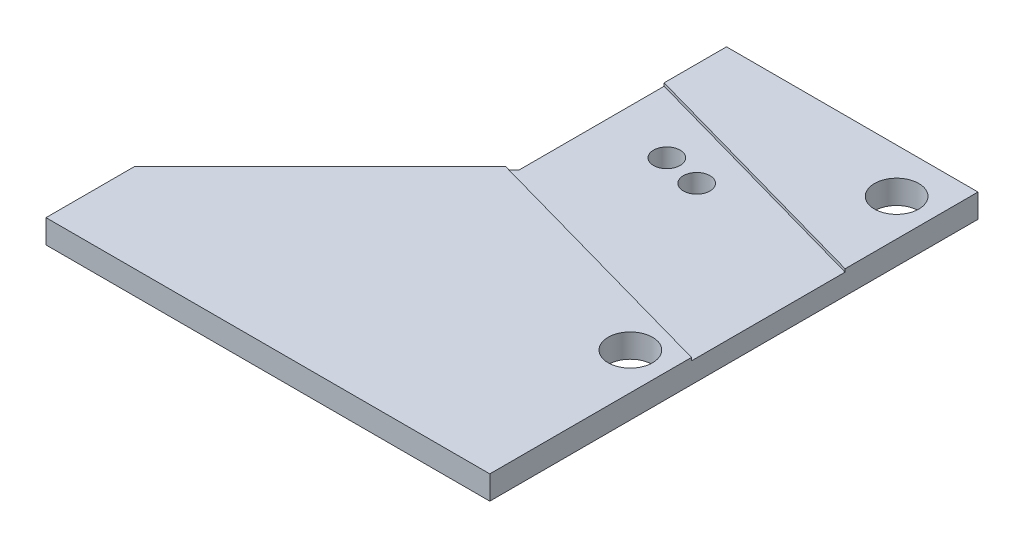
ISO-10303-21;
HEADER;
FILE_DESCRIPTION(('STEP AP214'),'2;1');
FILE_NAME('part.step','',(''),(''),'','','');
FILE_SCHEMA(('AUTOMOTIVE_DESIGN { 1 0 10303 214 1 1 1 1 }'));
ENDSEC;
DATA;
#1=APPLICATION_CONTEXT('core data for automotive mechanical design processes');
#2=APPLICATION_PROTOCOL_DEFINITION('international standard','automotive_design',2000,#1);
#3=PRODUCT_CONTEXT('',#1,'mechanical');
#4=PRODUCT('Part','Part','',(#3));
#5=PRODUCT_RELATED_PRODUCT_CATEGORY('part','',(#4));
#6=PRODUCT_DEFINITION_FORMATION('','',#4);
#7=PRODUCT_DEFINITION_CONTEXT('part definition',#1,'design');
#8=PRODUCT_DEFINITION('design','',#6,#7);
#9=PRODUCT_DEFINITION_SHAPE('','',#8);
#10=(LENGTH_UNIT() NAMED_UNIT(*) SI_UNIT(.MILLI.,.METRE.));
#11=(NAMED_UNIT(*) PLANE_ANGLE_UNIT() SI_UNIT($,.RADIAN.));
#12=(NAMED_UNIT(*) SI_UNIT($,.STERADIAN.) SOLID_ANGLE_UNIT());
#13=UNCERTAINTY_MEASURE_WITH_UNIT(LENGTH_MEASURE(1.E-05),#10,'distance_accuracy_value','');
#14=(GEOMETRIC_REPRESENTATION_CONTEXT(3) GLOBAL_UNCERTAINTY_ASSIGNED_CONTEXT((#13)) GLOBAL_UNIT_ASSIGNED_CONTEXT((#10,
#11,#12)) REPRESENTATION_CONTEXT('',''));
#15=CARTESIAN_POINT('',(0.,0.,0.));
#16=DIRECTION('',(0.,0.,1.));
#17=DIRECTION('',(1.,0.,0.));
#18=AXIS2_PLACEMENT_3D('',#15,#16,#17);
#19=CARTESIAN_POINT('',(-17.,1.6,-12.));
#20=DIRECTION('',(0.,-1.,0.));
#21=DIRECTION('',(0.,0.,-1.));
#22=AXIS2_PLACEMENT_3D('',#19,#20,#21);
#23=PLANE('',#22);
#24=CARTESIAN_POINT('',(-2.49999999999999,1.6,-9.00000000000003));
#25=DIRECTION('',(0.,1.,0.));
#26=DIRECTION('',(0.,0.,1.));
#27=AXIS2_PLACEMENT_3D('',#24,#25,#26);
#28=CIRCLE('',#27,1.5);
#29=CARTESIAN_POINT('',(-2.49999999999999,1.6,-7.50000000000003));
#30=VERTEX_POINT('',#29);
#31=EDGE_CURVE('E206',#30,#30,#28,.T.);
#32=ORIENTED_EDGE('',*,*,#31,.F.);
#33=EDGE_LOOP('',(#32));
#34=FACE_BOUND('',#33,.T.);
#35=DIRECTION('',(0.,0.,1.));
#36=VECTOR('',#35,1.);
#37=CARTESIAN_POINT('',(-17.,1.6,1.99999999999997));
#38=LINE('',#37,#36);
#39=CARTESIAN_POINT('',(-17.,1.6,-12.));
#40=VERTEX_POINT('',#39);
#41=CARTESIAN_POINT('',(-17.,1.6,-7.78282788304414));
#42=VERTEX_POINT('',#41);
#43=EDGE_CURVE('E145',#40,#42,#38,.T.);
#44=ORIENTED_EDGE('',*,*,#43,.T.);
#45=DIRECTION('',(-0.96288130445857,0.,-0.269925162821406));
#46=VECTOR('',#45,1.);
#47=CARTESIAN_POINT('',(0.,1.6,-3.01720646458265));
#48=LINE('',#47,#46);
#49=CARTESIAN_POINT('',(0.,1.6,-3.01720646458265));
#50=VERTEX_POINT('',#49);
#51=EDGE_CURVE('E189',#50,#42,#48,.T.);
#52=ORIENTED_EDGE('',*,*,#51,.F.);
#53=DIRECTION('',(0.,0.,-1.));
#54=VECTOR('',#53,1.);
#55=CARTESIAN_POINT('',(0.,1.6,-12.));
#56=LINE('',#55,#54);
#57=CARTESIAN_POINT('',(0.,1.6,-12.));
#58=VERTEX_POINT('',#57);
#59=EDGE_CURVE('E110',#50,#58,#56,.T.);
#60=ORIENTED_EDGE('',*,*,#59,.T.);
#61=DIRECTION('',(-1.,0.,0.));
#62=VECTOR('',#61,1.);
#63=CARTESIAN_POINT('',(-17.,1.6,-12.));
#64=LINE('',#63,#62);
#65=EDGE_CURVE('E56',#58,#40,#64,.T.);
#66=ORIENTED_EDGE('',*,*,#65,.T.);
#67=EDGE_LOOP('',(#44,#52,#60,#66));
#68=FACE_BOUND('',#67,.T.);
#69=ADVANCED_FACE('F31',(#34,#68),#23,.F.);
#70=CARTESIAN_POINT('',(-12.7196307856983,0.,-3.68506051274071));
#71=DIRECTION('',(0.,1.,0.));
#72=DIRECTION('',(0.,0.,1.));
#73=AXIS2_PLACEMENT_3D('',#70,#71,#72);
#74=CYLINDRICAL_SURFACE('',#73,0.900000000000002);
#75=CARTESIAN_POINT('',(-12.7196307856983,0.,-3.68506051274071));
#76=DIRECTION('',(0.,1.,0.));
#77=DIRECTION('',(0.,0.,1.));
#78=AXIS2_PLACEMENT_3D('',#75,#76,#77);
#79=CIRCLE('',#78,0.900000000000002);
#80=CARTESIAN_POINT('',(-12.7196307856983,0.,-2.78506051274071));
#81=VERTEX_POINT('',#80);
#82=EDGE_CURVE('E137',#81,#81,#79,.T.);
#83=ORIENTED_EDGE('',*,*,#82,.F.);
#84=EDGE_LOOP('',(#83));
#85=FACE_BOUND('',#84,.T.);
#86=CARTESIAN_POINT('',(-12.7196307856983,1.4,-3.68506051274071));
#87=DIRECTION('',(0.,1.,0.));
#88=DIRECTION('',(0.,0.,1.));
#89=AXIS2_PLACEMENT_3D('',#86,#87,#88);
#90=CIRCLE('',#89,0.900000000000002);
#91=CARTESIAN_POINT('',(-12.7196307856983,1.4,-2.78506051274071));
#92=VERTEX_POINT('',#91);
#93=EDGE_CURVE('E176',#92,#92,#90,.F.);
#94=ORIENTED_EDGE('',*,*,#93,.F.);
#95=EDGE_LOOP('',(#94));
#96=FACE_BOUND('',#95,.T.);
#97=ADVANCED_FACE('F238',(#85,#96),#74,.F.);
#98=CARTESIAN_POINT('',(-10.2158849243789,0.,-3.20157663304442));
#99=DIRECTION('',(0.,1.,0.));
#100=DIRECTION('',(0.,0.,1.));
#101=AXIS2_PLACEMENT_3D('',#98,#99,#100);
#102=CYLINDRICAL_SURFACE('',#101,0.900000000000002);
#103=CARTESIAN_POINT('',(-10.2158849243789,0.,-3.20157663304442));
#104=DIRECTION('',(0.,1.,0.));
#105=DIRECTION('',(0.,0.,1.));
#106=AXIS2_PLACEMENT_3D('',#103,#104,#105);
#107=CIRCLE('',#106,0.900000000000002);
#108=CARTESIAN_POINT('',(-10.2158849243789,0.,-2.30157663304442));
#109=VERTEX_POINT('',#108);
#110=EDGE_CURVE('E173',#109,#109,#107,.T.);
#111=ORIENTED_EDGE('',*,*,#110,.F.);
#112=EDGE_LOOP('',(#111));
#113=FACE_BOUND('',#112,.T.);
#114=CARTESIAN_POINT('',(-10.2158849243789,1.4,-3.20157663304442));
#115=DIRECTION('',(0.,1.,0.));
#116=DIRECTION('',(0.,0.,1.));
#117=AXIS2_PLACEMENT_3D('',#114,#115,#116);
#118=CIRCLE('',#117,0.900000000000002);
#119=CARTESIAN_POINT('',(-10.2158849243789,1.4,-2.30157663304442));
#120=VERTEX_POINT('',#119);
#121=EDGE_CURVE('E35',#120,#120,#118,.F.);
#122=ORIENTED_EDGE('',*,*,#121,.F.);
#123=EDGE_LOOP('',(#122));
#124=FACE_BOUND('',#123,.T.);
#125=ADVANCED_FACE('F243',(#113,#124),#102,.F.);
#126=CARTESIAN_POINT('',(-17.,1.6,1.99999999999997));
#127=DIRECTION('',(1.,0.,0.));
#128=DIRECTION('',(0.,0.,-1.));
#129=AXIS2_PLACEMENT_3D('',#126,#127,#128);
#130=PLANE('',#129);
#131=DIRECTION('',(0.,0.,1.));
#132=VECTOR('',#131,1.);
#133=CARTESIAN_POINT('',(-17.,1.4,-7.78282788304414));
#134=LINE('',#133,#132);
#135=CARTESIAN_POINT('',(-17.,1.4,-7.78282788304414));
#136=VERTEX_POINT('',#135);
#137=CARTESIAN_POINT('',(-17.,1.4,1.99999999999997));
#138=VERTEX_POINT('',#137);
#139=EDGE_CURVE('E201',#136,#138,#134,.T.);
#140=ORIENTED_EDGE('',*,*,#139,.F.);
#141=DIRECTION('',(0.,1.,0.));
#142=VECTOR('',#141,1.);
#143=CARTESIAN_POINT('',(-17.,1.4,-7.78282788304414));
#144=LINE('',#143,#142);
#145=EDGE_CURVE('E166',#136,#42,#144,.T.);
#146=ORIENTED_EDGE('',*,*,#145,.T.);
#147=ORIENTED_EDGE('',*,*,#43,.F.);
#148=DIRECTION('',(0.,-1.,0.));
#149=VECTOR('',#148,1.);
#150=CARTESIAN_POINT('',(-17.,1.6,-12.));
#151=LINE('',#150,#149);
#152=CARTESIAN_POINT('',(-17.,0.,-12.));
#153=VERTEX_POINT('',#152);
#154=EDGE_CURVE('E129',#40,#153,#151,.T.);
#155=ORIENTED_EDGE('',*,*,#154,.T.);
#156=DIRECTION('',(0.,0.,1.));
#157=VECTOR('',#156,1.);
#158=CARTESIAN_POINT('',(-17.,0.,1.99999999999997));
#159=LINE('',#158,#157);
#160=CARTESIAN_POINT('',(-17.,0.,1.99999999999997));
#161=VERTEX_POINT('',#160);
#162=EDGE_CURVE('E133',#153,#161,#159,.T.);
#163=ORIENTED_EDGE('',*,*,#162,.T.);
#164=DIRECTION('',(0.,-1.,0.));
#165=VECTOR('',#164,1.);
#166=CARTESIAN_POINT('',(-17.,1.6,1.99999999999997));
#167=LINE('',#166,#165);
#168=EDGE_CURVE('E11',#138,#161,#167,.T.);
#169=ORIENTED_EDGE('',*,*,#168,.F.);
#170=EDGE_LOOP('',(#140,#146,#147,#155,#163,#169));
#171=FACE_BOUND('',#170,.T.);
#172=ADVANCED_FACE('F33',(#171),#130,.F.);
#173=CARTESIAN_POINT('',(-17.,1.6,1.99999999999997));
#174=DIRECTION('',(0.707106781186549,0.,0.707106781186546));
#175=DIRECTION('',(0.707106781186546,0.,-0.707106781186549));
#176=AXIS2_PLACEMENT_3D('',#173,#174,#175);
#177=PLANE('',#176);
#178=DIRECTION('',(-0.707106781186546,0.,0.707106781186549));
#179=VECTOR('',#178,1.);
#180=CARTESIAN_POINT('',(-17.,1.6,1.99999999999997));
#181=LINE('',#180,#179);
#182=CARTESIAN_POINT('',(-17.4707129156786,1.6,2.47071291567858));
#183=VERTEX_POINT('',#182);
#184=CARTESIAN_POINT('',(-30.,1.6,15.));
#185=VERTEX_POINT('',#184);
#186=EDGE_CURVE('E90',#183,#185,#181,.T.);
#187=ORIENTED_EDGE('',*,*,#186,.F.);
#188=DIRECTION('',(0.,1.,0.));
#189=VECTOR('',#188,1.);
#190=CARTESIAN_POINT('',(-17.4707129156786,1.4,2.47071291567859));
#191=LINE('',#190,#189);
#192=CARTESIAN_POINT('',(-17.4707129156786,1.4,2.47071291567859));
#193=VERTEX_POINT('',#192);
#194=EDGE_CURVE('E47',#193,#183,#191,.T.);
#195=ORIENTED_EDGE('',*,*,#194,.F.);
#196=DIRECTION('',(-0.707106781186546,0.,0.707106781186549));
#197=VECTOR('',#196,1.);
#198=CARTESIAN_POINT('',(-17.,1.4,1.99999999999997));
#199=LINE('',#198,#197);
#200=EDGE_CURVE('E198',#138,#193,#199,.T.);
#201=ORIENTED_EDGE('',*,*,#200,.F.);
#202=ORIENTED_EDGE('',*,*,#168,.T.);
#203=DIRECTION('',(-0.707106781186546,0.,0.707106781186549));
#204=VECTOR('',#203,1.);
#205=CARTESIAN_POINT('',(-17.,0.,1.99999999999997));
#206=LINE('',#205,#204);
#207=CARTESIAN_POINT('',(-30.,0.,15.));
#208=VERTEX_POINT('',#207);
#209=EDGE_CURVE('E136',#161,#208,#206,.T.);
#210=ORIENTED_EDGE('',*,*,#209,.T.);
#211=DIRECTION('',(0.,-1.,0.));
#212=VECTOR('',#211,1.);
#213=CARTESIAN_POINT('',(-30.,1.6,15.));
#214=LINE('',#213,#212);
#215=EDGE_CURVE('E40',#185,#208,#214,.T.);
#216=ORIENTED_EDGE('',*,*,#215,.F.);
#217=EDGE_LOOP('',(#187,#195,#201,#202,#210,#216));
#218=FACE_BOUND('',#217,.T.);
#219=ADVANCED_FACE('F269',(#218),#177,.F.);
#220=CARTESIAN_POINT('',(-30.,1.6,15.));
#221=DIRECTION('',(1.,0.,0.));
#222=DIRECTION('',(0.,0.,-1.));
#223=AXIS2_PLACEMENT_3D('',#220,#221,#222);
#224=PLANE('',#223);
#225=DIRECTION('',(0.,0.,1.));
#226=VECTOR('',#225,1.);
#227=CARTESIAN_POINT('',(-30.,0.,15.));
#228=LINE('',#227,#226);
#229=CARTESIAN_POINT('',(-30.,0.,21.));
#230=VERTEX_POINT('',#229);
#231=EDGE_CURVE('E139',#208,#230,#228,.T.);
#232=ORIENTED_EDGE('',*,*,#231,.T.);
#233=DIRECTION('',(0.,-1.,0.));
#234=VECTOR('',#233,1.);
#235=CARTESIAN_POINT('',(-30.,1.6,21.));
#236=LINE('',#235,#234);
#237=CARTESIAN_POINT('',(-30.,1.6,21.));
#238=VERTEX_POINT('',#237);
#239=EDGE_CURVE('E119',#238,#230,#236,.T.);
#240=ORIENTED_EDGE('',*,*,#239,.F.);
#241=DIRECTION('',(0.,0.,1.));
#242=VECTOR('',#241,1.);
#243=CARTESIAN_POINT('',(-30.,1.6,15.));
#244=LINE('',#243,#242);
#245=EDGE_CURVE('E106',#185,#238,#244,.T.);
#246=ORIENTED_EDGE('',*,*,#245,.F.);
#247=ORIENTED_EDGE('',*,*,#215,.T.);
#248=EDGE_LOOP('',(#232,#240,#246,#247));
#249=FACE_BOUND('',#248,.T.);
#250=ADVANCED_FACE('F152',(#249),#224,.F.);
#251=CARTESIAN_POINT('',(0.,1.6,21.));
#252=DIRECTION('',(0.,0.,-1.));
#253=DIRECTION('',(-1.,0.,0.));
#254=AXIS2_PLACEMENT_3D('',#251,#252,#253);
#255=PLANE('',#254);
#256=DIRECTION('',(1.,0.,0.));
#257=VECTOR('',#256,1.);
#258=CARTESIAN_POINT('',(0.,0.,21.));
#259=LINE('',#258,#257);
#260=CARTESIAN_POINT('',(0.,0.,21.));
#261=VERTEX_POINT('',#260);
#262=EDGE_CURVE('E116',#230,#261,#259,.T.);
#263=ORIENTED_EDGE('',*,*,#262,.T.);
#264=DIRECTION('',(0.,-1.,0.));
#265=VECTOR('',#264,1.);
#266=CARTESIAN_POINT('',(0.,1.6,21.));
#267=LINE('',#266,#265);
#268=CARTESIAN_POINT('',(0.,1.6,21.));
#269=VERTEX_POINT('',#268);
#270=EDGE_CURVE('E113',#269,#261,#267,.T.);
#271=ORIENTED_EDGE('',*,*,#270,.F.);
#272=DIRECTION('',(1.,0.,0.));
#273=VECTOR('',#272,1.);
#274=CARTESIAN_POINT('',(0.,1.6,21.));
#275=LINE('',#274,#273);
#276=EDGE_CURVE('E99',#238,#269,#275,.T.);
#277=ORIENTED_EDGE('',*,*,#276,.F.);
#278=ORIENTED_EDGE('',*,*,#239,.T.);
#279=EDGE_LOOP('',(#263,#271,#277,#278));
#280=FACE_BOUND('',#279,.T.);
#281=ADVANCED_FACE('F114',(#280),#255,.F.);
#282=CARTESIAN_POINT('',(0.,1.6,-12.));
#283=DIRECTION('',(-1.,0.,0.));
#284=DIRECTION('',(0.,0.,1.));
#285=AXIS2_PLACEMENT_3D('',#282,#283,#284);
#286=PLANE('',#285);
#287=ORIENTED_EDGE('',*,*,#59,.F.);
#288=DIRECTION('',(0.,1.,0.));
#289=VECTOR('',#288,1.);
#290=CARTESIAN_POINT('',(0.,1.4,-3.01720646458265));
#291=LINE('',#290,#289);
#292=CARTESIAN_POINT('',(0.,1.4,-3.01720646458265));
#293=VERTEX_POINT('',#292);
#294=EDGE_CURVE('E183',#293,#50,#291,.T.);
#295=ORIENTED_EDGE('',*,*,#294,.F.);
#296=DIRECTION('',(0.,0.,-1.));
#297=VECTOR('',#296,1.);
#298=CARTESIAN_POINT('',(0.,1.4,7.36828960195799));
#299=LINE('',#298,#297);
#300=CARTESIAN_POINT('',(0.,1.4,7.36828960195799));
#301=VERTEX_POINT('',#300);
#302=EDGE_CURVE('E180',#301,#293,#299,.T.);
#303=ORIENTED_EDGE('',*,*,#302,.F.);
#304=DIRECTION('',(0.,1.,0.));
#305=VECTOR('',#304,1.);
#306=CARTESIAN_POINT('',(0.,1.4,7.36828960195799));
#307=LINE('',#306,#305);
#308=CARTESIAN_POINT('',(0.,1.6,7.36828960195799));
#309=VERTEX_POINT('',#308);
#310=EDGE_CURVE('E127',#301,#309,#307,.T.);
#311=ORIENTED_EDGE('',*,*,#310,.T.);
#312=EDGE_CURVE('E104',#269,#309,#56,.T.);
#313=ORIENTED_EDGE('',*,*,#312,.F.);
#314=ORIENTED_EDGE('',*,*,#270,.T.);
#315=DIRECTION('',(0.,0.,-1.));
#316=VECTOR('',#315,1.);
#317=CARTESIAN_POINT('',(0.,0.,-12.));
#318=LINE('',#317,#316);
#319=CARTESIAN_POINT('',(0.,0.,-12.));
#320=VERTEX_POINT('',#319);
#321=EDGE_CURVE('E142',#261,#320,#318,.T.);
#322=ORIENTED_EDGE('',*,*,#321,.T.);
#323=DIRECTION('',(0.,-1.,0.));
#324=VECTOR('',#323,1.);
#325=CARTESIAN_POINT('',(0.,1.6,-12.));
#326=LINE('',#325,#324);
#327=EDGE_CURVE('E120',#58,#320,#326,.T.);
#328=ORIENTED_EDGE('',*,*,#327,.F.);
#329=EDGE_LOOP('',(#287,#295,#303,#311,#313,#314,#322,#328));
#330=FACE_BOUND('',#329,.T.);
#331=ADVANCED_FACE('F124',(#330),#286,.F.);
#332=CARTESIAN_POINT('',(-17.,1.6,-12.));
#333=DIRECTION('',(0.,0.,1.));
#334=DIRECTION('',(1.,0.,0.));
#335=AXIS2_PLACEMENT_3D('',#332,#333,#334);
#336=PLANE('',#335);
#337=DIRECTION('',(-1.,0.,0.));
#338=VECTOR('',#337,1.);
#339=CARTESIAN_POINT('',(-17.,0.,-12.));
#340=LINE('',#339,#338);
#341=EDGE_CURVE('E82',#320,#153,#340,.T.);
#342=ORIENTED_EDGE('',*,*,#341,.T.);
#343=ORIENTED_EDGE('',*,*,#154,.F.);
#344=ORIENTED_EDGE('',*,*,#65,.F.);
#345=ORIENTED_EDGE('',*,*,#327,.T.);
#346=EDGE_LOOP('',(#342,#343,#344,#345));
#347=FACE_BOUND('',#346,.T.);
#348=ADVANCED_FACE('F159',(#347),#336,.F.);
#349=CARTESIAN_POINT('',(-2.49999999999999,1.6,8.99999999999998));
#350=DIRECTION('',(0.,1.,0.));
#351=DIRECTION('',(0.,0.,1.));
#352=AXIS2_PLACEMENT_3D('',#349,#350,#351);
#353=CIRCLE('',#352,1.5);
#354=CARTESIAN_POINT('',(-2.49999999999999,1.6,10.5));
#355=VERTEX_POINT('',#354);
#356=EDGE_CURVE('E212',#355,#355,#353,.T.);
#357=ORIENTED_EDGE('',*,*,#356,.F.);
#358=EDGE_LOOP('',(#357));
#359=FACE_BOUND('',#358,.T.);
#360=ORIENTED_EDGE('',*,*,#312,.T.);
#361=DIRECTION('',(0.96288130445857,0.,0.269925162821406));
#362=VECTOR('',#361,1.);
#363=CARTESIAN_POINT('',(-17.4707129156786,1.6,2.47071291567859));
#364=LINE('',#363,#362);
#365=EDGE_CURVE('E186',#183,#309,#364,.T.);
#366=ORIENTED_EDGE('',*,*,#365,.F.);
#367=ORIENTED_EDGE('',*,*,#186,.T.);
#368=ORIENTED_EDGE('',*,*,#245,.T.);
#369=ORIENTED_EDGE('',*,*,#276,.T.);
#370=EDGE_LOOP('',(#360,#366,#367,#368,#369));
#371=FACE_BOUND('',#370,.T.);
#372=ADVANCED_FACE('F101',(#359,#371),#23,.F.);
#373=CARTESIAN_POINT('',(-17.,0.,-12.));
#374=DIRECTION('',(0.,-1.,0.));
#375=DIRECTION('',(0.,0.,-1.));
#376=AXIS2_PLACEMENT_3D('',#373,#374,#375);
#377=PLANE('',#376);
#378=CARTESIAN_POINT('',(-2.49999999999999,0.,8.99999999999998));
#379=DIRECTION('',(0.,1.,0.));
#380=DIRECTION('',(0.,0.,1.));
#381=AXIS2_PLACEMENT_3D('',#378,#379,#380);
#382=CIRCLE('',#381,1.5);
#383=CARTESIAN_POINT('',(-2.49999999999999,0.,10.5));
#384=VERTEX_POINT('',#383);
#385=EDGE_CURVE('E209',#384,#384,#382,.T.);
#386=ORIENTED_EDGE('',*,*,#385,.T.);
#387=EDGE_LOOP('',(#386));
#388=FACE_BOUND('',#387,.T.);
#389=CARTESIAN_POINT('',(-2.49999999999999,0.,-9.00000000000003));
#390=DIRECTION('',(0.,1.,0.));
#391=DIRECTION('',(0.,0.,1.));
#392=AXIS2_PLACEMENT_3D('',#389,#390,#391);
#393=CIRCLE('',#392,1.5);
#394=CARTESIAN_POINT('',(-2.49999999999999,0.,-7.50000000000003));
#395=VERTEX_POINT('',#394);
#396=EDGE_CURVE('E192',#395,#395,#393,.T.);
#397=ORIENTED_EDGE('',*,*,#396,.T.);
#398=EDGE_LOOP('',(#397));
#399=FACE_BOUND('',#398,.T.);
#400=ORIENTED_EDGE('',*,*,#110,.T.);
#401=EDGE_LOOP('',(#400));
#402=FACE_BOUND('',#401,.T.);
#403=ORIENTED_EDGE('',*,*,#82,.T.);
#404=EDGE_LOOP('',(#403));
#405=FACE_BOUND('',#404,.T.);
#406=ORIENTED_EDGE('',*,*,#162,.F.);
#407=ORIENTED_EDGE('',*,*,#341,.F.);
#408=ORIENTED_EDGE('',*,*,#321,.F.);
#409=ORIENTED_EDGE('',*,*,#262,.F.);
#410=ORIENTED_EDGE('',*,*,#231,.F.);
#411=ORIENTED_EDGE('',*,*,#209,.F.);
#412=EDGE_LOOP('',(#406,#407,#408,#409,#410,#411));
#413=FACE_BOUND('',#412,.T.);
#414=ADVANCED_FACE('F157',(#388,#399,#402,#405,#413),#377,.T.);
#415=CARTESIAN_POINT('',(-17.,1.4,-7.78282788304414));
#416=DIRECTION('',(0.,1.,0.));
#417=DIRECTION('',(0.,0.,1.));
#418=AXIS2_PLACEMENT_3D('',#415,#416,#417);
#419=PLANE('',#418);
#420=ORIENTED_EDGE('',*,*,#121,.T.);
#421=EDGE_LOOP('',(#420));
#422=FACE_BOUND('',#421,.T.);
#423=DIRECTION('',(-0.96288130445857,0.,-0.269925162821406));
#424=VECTOR('',#423,1.);
#425=CARTESIAN_POINT('',(0.,1.4,-3.01720646458265));
#426=LINE('',#425,#424);
#427=EDGE_CURVE('E188',#293,#136,#426,.T.);
#428=ORIENTED_EDGE('',*,*,#427,.T.);
#429=ORIENTED_EDGE('',*,*,#139,.T.);
#430=ORIENTED_EDGE('',*,*,#200,.T.);
#431=DIRECTION('',(0.96288130445857,0.,0.269925162821406));
#432=VECTOR('',#431,1.);
#433=CARTESIAN_POINT('',(-17.4707129156786,1.4,2.47071291567859));
#434=LINE('',#433,#432);
#435=EDGE_CURVE('E195',#193,#301,#434,.T.);
#436=ORIENTED_EDGE('',*,*,#435,.T.);
#437=ORIENTED_EDGE('',*,*,#302,.T.);
#438=EDGE_LOOP('',(#428,#429,#430,#436,#437));
#439=FACE_BOUND('',#438,.T.);
#440=ORIENTED_EDGE('',*,*,#93,.T.);
#441=EDGE_LOOP('',(#440));
#442=FACE_BOUND('',#441,.T.);
#443=ADVANCED_FACE('F233',(#422,#439,#442),#419,.T.);
#444=CARTESIAN_POINT('',(0.,1.4,-3.01720646458265));
#445=DIRECTION('',(0.269925162821406,0.,-0.96288130445857));
#446=DIRECTION('',(-0.96288130445857,0.,-0.269925162821406));
#447=AXIS2_PLACEMENT_3D('',#444,#445,#446);
#448=PLANE('',#447);
#449=ORIENTED_EDGE('',*,*,#51,.T.);
#450=ORIENTED_EDGE('',*,*,#145,.F.);
#451=ORIENTED_EDGE('',*,*,#427,.F.);
#452=ORIENTED_EDGE('',*,*,#294,.T.);
#453=EDGE_LOOP('',(#449,#450,#451,#452));
#454=FACE_BOUND('',#453,.T.);
#455=ADVANCED_FACE('F254',(#454),#448,.F.);
#456=CARTESIAN_POINT('',(-17.4707129156786,1.4,2.47071291567859));
#457=DIRECTION('',(-0.269925162821406,0.,0.96288130445857));
#458=DIRECTION('',(0.96288130445857,0.,0.269925162821406));
#459=AXIS2_PLACEMENT_3D('',#456,#457,#458);
#460=PLANE('',#459);
#461=ORIENTED_EDGE('',*,*,#365,.T.);
#462=ORIENTED_EDGE('',*,*,#310,.F.);
#463=ORIENTED_EDGE('',*,*,#435,.F.);
#464=ORIENTED_EDGE('',*,*,#194,.T.);
#465=EDGE_LOOP('',(#461,#462,#463,#464));
#466=FACE_BOUND('',#465,.T.);
#467=ADVANCED_FACE('F248',(#466),#460,.F.);
#468=CARTESIAN_POINT('',(-2.49999999999999,0.,-9.00000000000003));
#469=DIRECTION('',(0.,1.,0.));
#470=DIRECTION('',(0.,0.,1.));
#471=AXIS2_PLACEMENT_3D('',#468,#469,#470);
#472=CYLINDRICAL_SURFACE('',#471,1.5);
#473=ORIENTED_EDGE('',*,*,#396,.F.);
#474=EDGE_LOOP('',(#473));
#475=FACE_BOUND('',#474,.T.);
#476=ORIENTED_EDGE('',*,*,#31,.T.);
#477=EDGE_LOOP('',(#476));
#478=FACE_BOUND('',#477,.T.);
#479=ADVANCED_FACE('F223',(#475,#478),#472,.F.);
#480=CARTESIAN_POINT('',(-2.49999999999999,0.,8.99999999999998));
#481=DIRECTION('',(0.,1.,0.));
#482=DIRECTION('',(0.,0.,1.));
#483=AXIS2_PLACEMENT_3D('',#480,#481,#482);
#484=CYLINDRICAL_SURFACE('',#483,1.5);
#485=ORIENTED_EDGE('',*,*,#385,.F.);
#486=EDGE_LOOP('',(#485));
#487=FACE_BOUND('',#486,.T.);
#488=ORIENTED_EDGE('',*,*,#356,.T.);
#489=EDGE_LOOP('',(#488));
#490=FACE_BOUND('',#489,.T.);
#491=ADVANCED_FACE('F220',(#487,#490),#484,.F.);
#492=CLOSED_SHELL('',(#69,#97,#125,#172,#219,#250,#281,#331,#348,#372,#414,#443,#455,#467,#479,#491));
#493=MANIFOLD_SOLID_BREP('B2',#492);
#494=ADVANCED_BREP_SHAPE_REPRESENTATION('',(#18,#493),#14);
#495=SHAPE_DEFINITION_REPRESENTATION(#9,#494);
ENDSEC;
END-ISO-10303-21;
